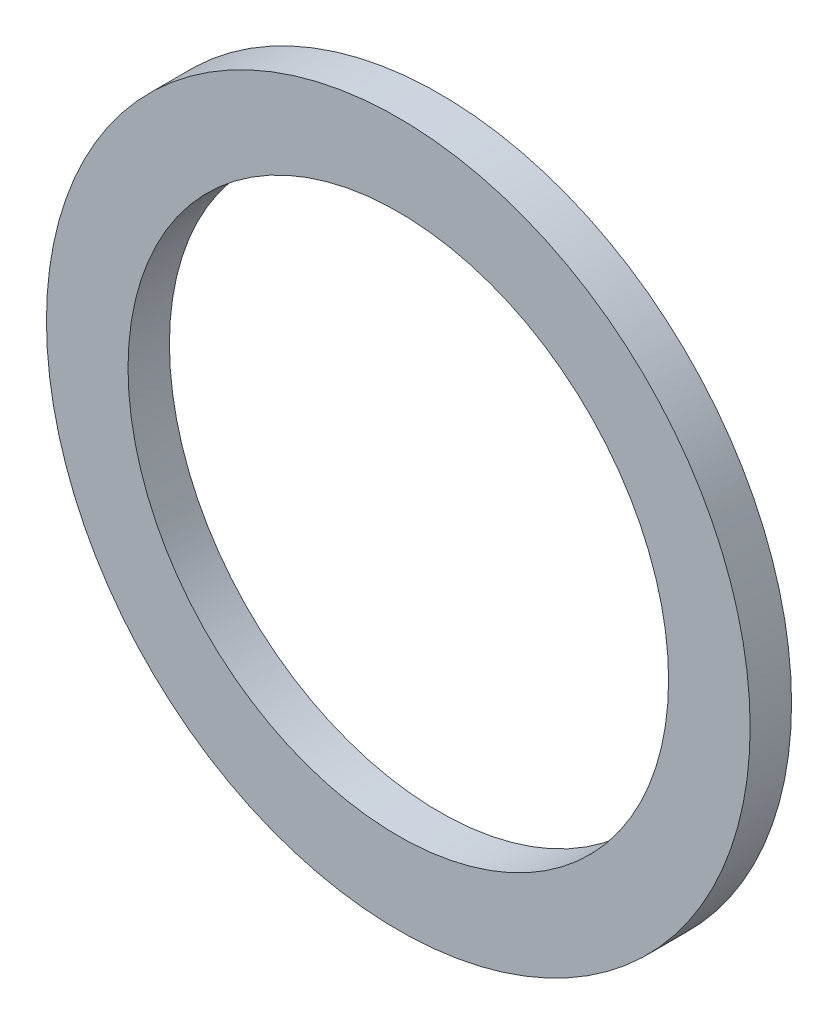
ISO-10303-21;
HEADER;
FILE_DESCRIPTION(('STEP AP214'),'2;1');
FILE_NAME('part.step','',(''),(''),'','','');
FILE_SCHEMA(('AUTOMOTIVE_DESIGN { 1 0 10303 214 1 1 1 1 }'));
ENDSEC;
DATA;
#1=APPLICATION_CONTEXT('core data for automotive mechanical design processes');
#2=APPLICATION_PROTOCOL_DEFINITION('international standard','automotive_design',2000,#1);
#3=PRODUCT_CONTEXT('',#1,'mechanical');
#4=PRODUCT('Part','Part','',(#3));
#5=PRODUCT_RELATED_PRODUCT_CATEGORY('part','',(#4));
#6=PRODUCT_DEFINITION_FORMATION('','',#4);
#7=PRODUCT_DEFINITION_CONTEXT('part definition',#1,'design');
#8=PRODUCT_DEFINITION('design','',#6,#7);
#9=PRODUCT_DEFINITION_SHAPE('','',#8);
#10=(LENGTH_UNIT() NAMED_UNIT(*) SI_UNIT(.MILLI.,.METRE.));
#11=(NAMED_UNIT(*) PLANE_ANGLE_UNIT() SI_UNIT($,.RADIAN.));
#12=(NAMED_UNIT(*) SI_UNIT($,.STERADIAN.) SOLID_ANGLE_UNIT());
#13=UNCERTAINTY_MEASURE_WITH_UNIT(LENGTH_MEASURE(1.E-05),#10,'distance_accuracy_value','');
#14=(GEOMETRIC_REPRESENTATION_CONTEXT(3) GLOBAL_UNCERTAINTY_ASSIGNED_CONTEXT((#13)) GLOBAL_UNIT_ASSIGNED_CONTEXT((#10,
#11,#12)) REPRESENTATION_CONTEXT('',''));
#15=CARTESIAN_POINT('',(0.,0.,0.));
#16=DIRECTION('',(0.,0.,1.));
#17=DIRECTION('',(1.,0.,0.));
#18=AXIS2_PLACEMENT_3D('',#15,#16,#17);
#19=CARTESIAN_POINT('',(0.,0.,-1.7));
#20=DIRECTION('',(0.,0.,1.));
#21=DIRECTION('',(1.,0.,0.));
#22=AXIS2_PLACEMENT_3D('',#19,#20,#21);
#23=CYLINDRICAL_SURFACE('',#22,14.45);
#24=CARTESIAN_POINT('',(0.,0.,-1.7));
#25=DIRECTION('',(0.,0.,1.));
#26=DIRECTION('',(1.,0.,0.));
#27=AXIS2_PLACEMENT_3D('',#24,#25,#26);
#28=CIRCLE('',#27,14.45);
#29=CARTESIAN_POINT('',(14.45,0.,-1.7));
#30=VERTEX_POINT('',#29);
#31=EDGE_CURVE('E10',#30,#30,#28,.T.);
#32=ORIENTED_EDGE('',*,*,#31,.T.);
#33=EDGE_LOOP('',(#32));
#34=FACE_BOUND('',#33,.T.);
#35=CARTESIAN_POINT('',(0.,0.,0.));
#36=DIRECTION('',(0.,0.,1.));
#37=DIRECTION('',(1.,0.,0.));
#38=AXIS2_PLACEMENT_3D('',#35,#36,#37);
#39=CIRCLE('',#38,14.45);
#40=CARTESIAN_POINT('',(14.45,0.,0.));
#41=VERTEX_POINT('',#40);
#42=EDGE_CURVE('E36',#41,#41,#39,.T.);
#43=ORIENTED_EDGE('',*,*,#42,.F.);
#44=EDGE_LOOP('',(#43));
#45=FACE_BOUND('',#44,.T.);
#46=ADVANCED_FACE('F33',(#34,#45),#23,.T.);
#47=CARTESIAN_POINT('',(0.,0.,-1.7));
#48=DIRECTION('',(0.,0.,1.));
#49=DIRECTION('',(1.,0.,0.));
#50=AXIS2_PLACEMENT_3D('',#47,#48,#49);
#51=PLANE('',#50);
#52=CARTESIAN_POINT('',(0.,0.,-1.7));
#53=DIRECTION('',(0.,0.,1.));
#54=DIRECTION('',(1.,0.,0.));
#55=AXIS2_PLACEMENT_3D('',#52,#53,#54);
#56=CIRCLE('',#55,11.1);
#57=CARTESIAN_POINT('',(11.1,0.,-1.7));
#58=VERTEX_POINT('',#57);
#59=EDGE_CURVE('E43',#58,#58,#56,.T.);
#60=ORIENTED_EDGE('',*,*,#59,.T.);
#61=EDGE_LOOP('',(#60));
#62=FACE_BOUND('',#61,.T.);
#63=ORIENTED_EDGE('',*,*,#31,.F.);
#64=EDGE_LOOP('',(#63));
#65=FACE_BOUND('',#64,.T.);
#66=ADVANCED_FACE('F51',(#62,#65),#51,.F.);
#67=CARTESIAN_POINT('',(0.,0.,0.));
#68=DIRECTION('',(0.,0.,1.));
#69=DIRECTION('',(1.,0.,0.));
#70=AXIS2_PLACEMENT_3D('',#67,#68,#69);
#71=PLANE('',#70);
#72=CARTESIAN_POINT('',(0.,0.,0.));
#73=DIRECTION('',(0.,0.,1.));
#74=DIRECTION('',(1.,0.,0.));
#75=AXIS2_PLACEMENT_3D('',#72,#73,#74);
#76=CIRCLE('',#75,11.1);
#77=CARTESIAN_POINT('',(11.1,0.,0.));
#78=VERTEX_POINT('',#77);
#79=EDGE_CURVE('E45',#78,#78,#76,.T.);
#80=ORIENTED_EDGE('',*,*,#79,.F.);
#81=EDGE_LOOP('',(#80));
#82=FACE_BOUND('',#81,.T.);
#83=ORIENTED_EDGE('',*,*,#42,.T.);
#84=EDGE_LOOP('',(#83));
#85=FACE_BOUND('',#84,.T.);
#86=ADVANCED_FACE('F57',(#82,#85),#71,.T.);
#87=CARTESIAN_POINT('',(0.,0.,-1.7));
#88=DIRECTION('',(0.,0.,1.));
#89=DIRECTION('',(1.,0.,0.));
#90=AXIS2_PLACEMENT_3D('',#87,#88,#89);
#91=CYLINDRICAL_SURFACE('',#90,11.1);
#92=ORIENTED_EDGE('',*,*,#59,.F.);
#93=EDGE_LOOP('',(#92));
#94=FACE_BOUND('',#93,.T.);
#95=ORIENTED_EDGE('',*,*,#79,.T.);
#96=EDGE_LOOP('',(#95));
#97=FACE_BOUND('',#96,.T.);
#98=ADVANCED_FACE('F54',(#94,#97),#91,.F.);
#99=CLOSED_SHELL('',(#46,#66,#86,#98));
#100=MANIFOLD_SOLID_BREP('B2',#99);
#101=ADVANCED_BREP_SHAPE_REPRESENTATION('',(#18,#100),#14);
#102=SHAPE_DEFINITION_REPRESENTATION(#9,#101);
ENDSEC;
END-ISO-10303-21;
